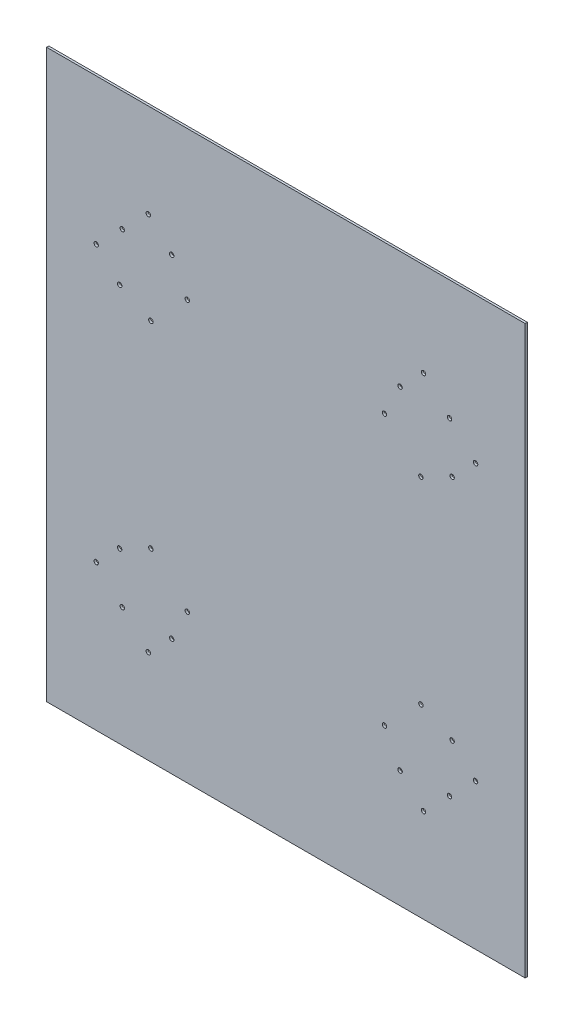
ISO-10303-21;
HEADER;
FILE_DESCRIPTION(('STEP AP214'),'2;1');
FILE_NAME('part.step','',(''),(''),'','','');
FILE_SCHEMA(('AUTOMOTIVE_DESIGN { 1 0 10303 214 1 1 1 1 }'));
ENDSEC;
DATA;
#1=APPLICATION_CONTEXT('core data for automotive mechanical design processes');
#2=APPLICATION_PROTOCOL_DEFINITION('international standard','automotive_design',2000,#1);
#3=PRODUCT_CONTEXT('',#1,'mechanical');
#4=PRODUCT('Part','Part','',(#3));
#5=PRODUCT_RELATED_PRODUCT_CATEGORY('part','',(#4));
#6=PRODUCT_DEFINITION_FORMATION('','',#4);
#7=PRODUCT_DEFINITION_CONTEXT('part definition',#1,'design');
#8=PRODUCT_DEFINITION('design','',#6,#7);
#9=PRODUCT_DEFINITION_SHAPE('','',#8);
#10=(LENGTH_UNIT() NAMED_UNIT(*) SI_UNIT(.MILLI.,.METRE.));
#11=(NAMED_UNIT(*) PLANE_ANGLE_UNIT() SI_UNIT($,.RADIAN.));
#12=(NAMED_UNIT(*) SI_UNIT($,.STERADIAN.) SOLID_ANGLE_UNIT());
#13=UNCERTAINTY_MEASURE_WITH_UNIT(LENGTH_MEASURE(1.E-05),#10,'distance_accuracy_value','');
#14=(GEOMETRIC_REPRESENTATION_CONTEXT(3) GLOBAL_UNCERTAINTY_ASSIGNED_CONTEXT((#13)) GLOBAL_UNIT_ASSIGNED_CONTEXT((#10,
#11,#12)) REPRESENTATION_CONTEXT('',''));
#15=CARTESIAN_POINT('',(0.,0.,0.));
#16=DIRECTION('',(0.,0.,1.));
#17=DIRECTION('',(1.,0.,0.));
#18=AXIS2_PLACEMENT_3D('',#15,#16,#17);
#19=CARTESIAN_POINT('',(0.,0.,3.));
#20=DIRECTION('',(0.,0.,1.));
#21=DIRECTION('',(1.,0.,0.));
#22=AXIS2_PLACEMENT_3D('',#19,#20,#21);
#23=PLANE('',#22);
#24=CARTESIAN_POINT('',(931.851249090738,-1320.80372791505,3.));
#25=DIRECTION('',(0.,0.,1.));
#26=DIRECTION('',(1.,0.,0.));
#27=AXIS2_PLACEMENT_3D('',#24,#25,#26);
#28=CIRCLE('',#27,3.00000000000015);
#29=CARTESIAN_POINT('',(934.851249090738,-1320.80372791505,3.));
#30=VERTEX_POINT('',#29);
#31=EDGE_CURVE('E265',#30,#30,#28,.T.);
#32=ORIENTED_EDGE('',*,*,#31,.F.);
#33=EDGE_LOOP('',(#32));
#34=FACE_BOUND('',#33,.T.);
#35=CARTESIAN_POINT('',(878.818240501748,-1246.55751589047,3.));
#36=DIRECTION('',(0.,0.,1.));
#37=DIRECTION('',(1.,0.,0.));
#38=AXIS2_PLACEMENT_3D('',#35,#36,#37);
#39=CIRCLE('',#38,3.00000000000015);
#40=CARTESIAN_POINT('',(881.818240501748,-1246.55751589047,3.));
#41=VERTEX_POINT('',#40);
#42=EDGE_CURVE('E253',#41,#41,#39,.T.);
#43=ORIENTED_EDGE('',*,*,#42,.F.);
#44=EDGE_LOOP('',(#43));
#45=FACE_BOUND('',#44,.T.);
#46=CARTESIAN_POINT('',(808.107562383088,-1317.26819400912,3.));
#47=DIRECTION('',(0.,0.,1.));
#48=DIRECTION('',(1.,0.,0.));
#49=AXIS2_PLACEMENT_3D('',#46,#47,#48);
#50=CIRCLE('',#49,3.00000000000015);
#51=CARTESIAN_POINT('',(811.107562383088,-1317.26819400912,3.));
#52=VERTEX_POINT('',#51);
#53=EDGE_CURVE('E241',#52,#52,#50,.T.);
#54=ORIENTED_EDGE('',*,*,#53,.F.);
#55=EDGE_LOOP('',(#54));
#56=FACE_BOUND('',#55,.T.);
#57=CARTESIAN_POINT('',(1249.20077248726,-1638.15325131158,3.));
#58=DIRECTION('',(0.,0.,1.));
#59=DIRECTION('',(1.,0.,0.));
#60=AXIS2_PLACEMENT_3D('',#57,#58,#59);
#61=CIRCLE('',#60,3.00000000000015);
#62=CARTESIAN_POINT('',(1252.20077248726,-1638.15325131158,3.));
#63=VERTEX_POINT('',#62);
#64=EDGE_CURVE('E229',#63,#63,#61,.T.);
#65=ORIENTED_EDGE('',*,*,#64,.F.);
#66=EDGE_LOOP('',(#65));
#67=FACE_BOUND('',#66,.T.);
#68=CARTESIAN_POINT('',(1220.9165012398,-1730.07713286583,3.));
#69=DIRECTION('',(0.,0.,1.));
#70=DIRECTION('',(1.,0.,0.));
#71=AXIS2_PLACEMENT_3D('',#68,#69,#70);
#72=CIRCLE('',#71,3.00000000000015);
#73=CARTESIAN_POINT('',(1223.9165012398,-1730.07713286583,3.));
#74=VERTEX_POINT('',#73);
#75=EDGE_CURVE('E217',#74,#74,#72,.T.);
#76=ORIENTED_EDGE('',*,*,#75,.F.);
#77=EDGE_LOOP('',(#76));
#78=FACE_BOUND('',#77,.T.);
#79=CARTESIAN_POINT('',(1288.09164545252,-1726.5415989599,3.));
#80=DIRECTION('',(0.,0.,1.));
#81=DIRECTION('',(1.,0.,0.));
#82=AXIS2_PLACEMENT_3D('',#79,#80,#81);
#83=CIRCLE('',#82,3.00000000000015);
#84=CARTESIAN_POINT('',(1291.09164545252,-1726.5415989599,3.));
#85=VERTEX_POINT('',#84);
#86=EDGE_CURVE('E205',#85,#85,#83,.T.);
#87=ORIENTED_EDGE('',*,*,#86,.F.);
#88=EDGE_LOOP('',(#87));
#89=FACE_BOUND('',#88,.T.);
#90=CARTESIAN_POINT('',(1291.62717935845,-1659.36645474718,3.));
#91=DIRECTION('',(0.,0.,1.));
#92=DIRECTION('',(1.,0.,0.));
#93=AXIS2_PLACEMENT_3D('',#90,#91,#92);
#94=CIRCLE('',#93,3.00000000000015);
#95=CARTESIAN_POINT('',(1294.62717935845,-1659.36645474718,3.));
#96=VERTEX_POINT('',#95);
#97=EDGE_CURVE('E193',#96,#96,#94,.T.);
#98=ORIENTED_EDGE('',*,*,#97,.F.);
#99=EDGE_LOOP('',(#98));
#100=FACE_BOUND('',#99,.T.);
#101=CARTESIAN_POINT('',(808.107562383088,-1691.18625990057,3.));
#102=DIRECTION('',(0.,0.,1.));
#103=DIRECTION('',(1.,0.,0.));
#104=AXIS2_PLACEMENT_3D('',#101,#102,#103);
#105=CIRCLE('',#104,3.00000000000015);
#106=CARTESIAN_POINT('',(811.107562383088,-1691.18625990057,3.));
#107=VERTEX_POINT('',#106);
#108=EDGE_CURVE('E181',#107,#107,#105,.T.);
#109=ORIENTED_EDGE('',*,*,#108,.F.);
#110=EDGE_LOOP('',(#109));
#111=FACE_BOUND('',#110,.T.);
#112=CARTESIAN_POINT('',(1252.73630639319,-1246.55751589047,3.));
#113=DIRECTION('',(0.,0.,1.));
#114=DIRECTION('',(1.,0.,0.));
#115=AXIS2_PLACEMENT_3D('',#112,#113,#114);
#116=CIRCLE('',#115,3.00000000000015);
#117=CARTESIAN_POINT('',(1255.73630639319,-1246.55751589047,3.));
#118=VERTEX_POINT('',#117);
#119=EDGE_CURVE('E169',#118,#118,#116,.T.);
#120=ORIENTED_EDGE('',*,*,#119,.F.);
#121=EDGE_LOOP('',(#120));
#122=FACE_BOUND('',#121,.T.);
#123=CARTESIAN_POINT('',(1220.9165012398,-1278.37732104386,3.));
#124=DIRECTION('',(0.,0.,1.));
#125=DIRECTION('',(1.,0.,0.));
#126=AXIS2_PLACEMENT_3D('',#123,#124,#125);
#127=CIRCLE('',#126,3.00000000000037);
#128=CARTESIAN_POINT('',(1223.9165012398,-1278.37732104386,3.));
#129=VERTEX_POINT('',#128);
#130=EDGE_CURVE('E157',#129,#129,#127,.T.);
#131=ORIENTED_EDGE('',*,*,#130,.F.);
#132=EDGE_LOOP('',(#131));
#133=FACE_BOUND('',#132,.T.);
#134=CARTESIAN_POINT('',(1249.20077248726,-1370.30120259811,3.));
#135=DIRECTION('',(0.,0.,1.));
#136=DIRECTION('',(1.,0.,0.));
#137=AXIS2_PLACEMENT_3D('',#134,#135,#136);
#138=CIRCLE('',#137,3.00000000000037);
#139=CARTESIAN_POINT('',(1252.20077248726,-1370.30120259811,3.));
#140=VERTEX_POINT('',#139);
#141=EDGE_CURVE('E145',#140,#140,#138,.T.);
#142=ORIENTED_EDGE('',*,*,#141,.F.);
#143=EDGE_LOOP('',(#142));
#144=FACE_BOUND('',#143,.T.);
#145=CARTESIAN_POINT('',(878.818240501748,-1761.89693801922,3.));
#146=DIRECTION('',(0.,0.,1.));
#147=DIRECTION('',(1.,0.,0.));
#148=AXIS2_PLACEMENT_3D('',#145,#146,#147);
#149=CIRCLE('',#148,3.00000000000015);
#150=CARTESIAN_POINT('',(881.818240501748,-1761.89693801922,3.));
#151=VERTEX_POINT('',#150);
#152=EDGE_CURVE('E133',#151,#151,#149,.T.);
#153=ORIENTED_EDGE('',*,*,#152,.F.);
#154=EDGE_LOOP('',(#153));
#155=FACE_BOUND('',#154,.T.);
#156=CARTESIAN_POINT('',(931.851249090738,-1687.65072599464,3.));
#157=DIRECTION('',(0.,0.,1.));
#158=DIRECTION('',(1.,0.,0.));
#159=AXIS2_PLACEMENT_3D('',#156,#157,#158);
#160=CIRCLE('',#159,3.00000000000015);
#161=CARTESIAN_POINT('',(934.851249090738,-1687.65072599464,3.));
#162=VERTEX_POINT('',#161);
#163=EDGE_CURVE('E121',#162,#162,#160,.T.);
#164=ORIENTED_EDGE('',*,*,#163,.F.);
#165=EDGE_LOOP('',(#164));
#166=FACE_BOUND('',#165,.T.);
#167=CARTESIAN_POINT('',(1288.09164545252,-1281.9128549498,3.));
#168=DIRECTION('',(0.,0.,1.));
#169=DIRECTION('',(1.,0.,0.));
#170=AXIS2_PLACEMENT_3D('',#167,#168,#169);
#171=CIRCLE('',#170,3.00000000000015);
#172=CARTESIAN_POINT('',(1291.09164545252,-1281.9128549498,3.));
#173=VERTEX_POINT('',#172);
#174=EDGE_CURVE('E100',#173,#173,#171,.T.);
#175=ORIENTED_EDGE('',*,*,#174,.F.);
#176=EDGE_LOOP('',(#175));
#177=FACE_BOUND('',#176,.T.);
#178=DIRECTION('',(0.,-1.,0.));
#179=VECTOR('',#178,1.);
#180=CARTESIAN_POINT('',(740.777273447474,-1119.22722695485,3.));
#181=LINE('',#180,#179);
#182=CARTESIAN_POINT('',(740.777273447474,-1119.22722695485,3.));
#183=VERTEX_POINT('',#182);
#184=CARTESIAN_POINT('',(740.777273447474,-1889.22722695485,3.));
#185=VERTEX_POINT('',#184);
#186=EDGE_CURVE('E85',#183,#185,#181,.T.);
#187=ORIENTED_EDGE('',*,*,#186,.T.);
#188=DIRECTION('',(1.,0.,0.));
#189=VECTOR('',#188,1.);
#190=CARTESIAN_POINT('',(740.777273447474,-1889.22722695485,3.));
#191=LINE('',#190,#189);
#192=CARTESIAN_POINT('',(1390.77727344747,-1889.22722695485,3.));
#193=VERTEX_POINT('',#192);
#194=EDGE_CURVE('E80',#185,#193,#191,.T.);
#195=ORIENTED_EDGE('',*,*,#194,.T.);
#196=DIRECTION('',(0.,1.,0.));
#197=VECTOR('',#196,1.);
#198=CARTESIAN_POINT('',(1390.77727344747,-1889.22722695485,3.));
#199=LINE('',#198,#197);
#200=CARTESIAN_POINT('',(1390.77727344747,-1119.22722695485,3.));
#201=VERTEX_POINT('',#200);
#202=EDGE_CURVE('E83',#193,#201,#199,.T.);
#203=ORIENTED_EDGE('',*,*,#202,.T.);
#204=DIRECTION('',(-1.,0.,0.));
#205=VECTOR('',#204,1.);
#206=CARTESIAN_POINT('',(1390.77727344747,-1119.22722695485,3.));
#207=LINE('',#206,#205);
#208=EDGE_CURVE('E50',#201,#183,#207,.T.);
#209=ORIENTED_EDGE('',*,*,#208,.T.);
#210=EDGE_LOOP('',(#187,#195,#203,#209));
#211=FACE_BOUND('',#210,.T.);
#212=CARTESIAN_POINT('',(843.462901442418,-1726.5415989599,3.));
#213=DIRECTION('',(0.,0.,1.));
#214=DIRECTION('',(1.,0.,0.));
#215=AXIS2_PLACEMENT_3D('',#212,#213,#214);
#216=CIRCLE('',#215,3.00000000000015);
#217=CARTESIAN_POINT('',(846.462901442418,-1726.5415989599,3.));
#218=VERTEX_POINT('',#217);
#219=EDGE_CURVE('E115',#218,#218,#216,.T.);
#220=ORIENTED_EDGE('',*,*,#219,.F.);
#221=EDGE_LOOP('',(#220));
#222=FACE_BOUND('',#221,.T.);
#223=CARTESIAN_POINT('',(910.638045655138,-1730.07713286583,3.));
#224=DIRECTION('',(0.,0.,1.));
#225=DIRECTION('',(1.,0.,0.));
#226=AXIS2_PLACEMENT_3D('',#223,#224,#225);
#227=CIRCLE('',#226,3.00000000000015);
#228=CARTESIAN_POINT('',(913.638045655138,-1730.07713286583,3.));
#229=VERTEX_POINT('',#228);
#230=EDGE_CURVE('E127',#229,#229,#227,.T.);
#231=ORIENTED_EDGE('',*,*,#230,.F.);
#232=EDGE_LOOP('',(#231));
#233=FACE_BOUND('',#232,.T.);
#234=CARTESIAN_POINT('',(1323.44698451185,-1317.26819400912,3.));
#235=DIRECTION('',(0.,0.,1.));
#236=DIRECTION('',(1.,0.,0.));
#237=AXIS2_PLACEMENT_3D('',#234,#235,#236);
#238=CIRCLE('',#237,3.00000000000015);
#239=CARTESIAN_POINT('',(1326.44698451185,-1317.26819400912,3.));
#240=VERTEX_POINT('',#239);
#241=EDGE_CURVE('E139',#240,#240,#238,.T.);
#242=ORIENTED_EDGE('',*,*,#241,.F.);
#243=EDGE_LOOP('',(#242));
#244=FACE_BOUND('',#243,.T.);
#245=CARTESIAN_POINT('',(1291.62717935845,-1349.08799916252,3.));
#246=DIRECTION('',(0.,0.,1.));
#247=DIRECTION('',(1.,0.,0.));
#248=AXIS2_PLACEMENT_3D('',#245,#246,#247);
#249=CIRCLE('',#248,3.00000000000015);
#250=CARTESIAN_POINT('',(1294.62717935845,-1349.08799916252,3.));
#251=VERTEX_POINT('',#250);
#252=EDGE_CURVE('E151',#251,#251,#249,.T.);
#253=ORIENTED_EDGE('',*,*,#252,.F.);
#254=EDGE_LOOP('',(#253));
#255=FACE_BOUND('',#254,.T.);
#256=CARTESIAN_POINT('',(1199.7032978042,-1320.80372791506,3.));
#257=DIRECTION('',(0.,0.,1.));
#258=DIRECTION('',(1.,0.,0.));
#259=AXIS2_PLACEMENT_3D('',#256,#257,#258);
#260=CIRCLE('',#259,3.00000000000015);
#261=CARTESIAN_POINT('',(1202.7032978042,-1320.80372791506,3.));
#262=VERTEX_POINT('',#261);
#263=EDGE_CURVE('E163',#262,#262,#260,.T.);
#264=ORIENTED_EDGE('',*,*,#263,.F.);
#265=EDGE_LOOP('',(#264));
#266=FACE_BOUND('',#265,.T.);
#267=CARTESIAN_POINT('',(882.353774407678,-1638.15325131158,3.));
#268=DIRECTION('',(0.,0.,1.));
#269=DIRECTION('',(1.,0.,0.));
#270=AXIS2_PLACEMENT_3D('',#267,#268,#269);
#271=CIRCLE('',#270,3.00000000000015);
#272=CARTESIAN_POINT('',(885.353774407678,-1638.15325131158,3.));
#273=VERTEX_POINT('',#272);
#274=EDGE_CURVE('E175',#273,#273,#271,.T.);
#275=ORIENTED_EDGE('',*,*,#274,.F.);
#276=EDGE_LOOP('',(#275));
#277=FACE_BOUND('',#276,.T.);
#278=CARTESIAN_POINT('',(839.927367536488,-1659.36645474717,3.));
#279=DIRECTION('',(0.,0.,1.));
#280=DIRECTION('',(1.,0.,0.));
#281=AXIS2_PLACEMENT_3D('',#278,#279,#280);
#282=CIRCLE('',#281,3.00000000000015);
#283=CARTESIAN_POINT('',(842.927367536488,-1659.36645474717,3.));
#284=VERTEX_POINT('',#283);
#285=EDGE_CURVE('E187',#284,#284,#282,.T.);
#286=ORIENTED_EDGE('',*,*,#285,.F.);
#287=EDGE_LOOP('',(#286));
#288=FACE_BOUND('',#287,.T.);
#289=CARTESIAN_POINT('',(1323.44698451185,-1691.18625990057,3.));
#290=DIRECTION('',(0.,0.,1.));
#291=DIRECTION('',(1.,0.,0.));
#292=AXIS2_PLACEMENT_3D('',#289,#290,#291);
#293=CIRCLE('',#292,3.00000000000015);
#294=CARTESIAN_POINT('',(1326.44698451185,-1691.18625990057,3.));
#295=VERTEX_POINT('',#294);
#296=EDGE_CURVE('E199',#295,#295,#293,.T.);
#297=ORIENTED_EDGE('',*,*,#296,.F.);
#298=EDGE_LOOP('',(#297));
#299=FACE_BOUND('',#298,.T.);
#300=CARTESIAN_POINT('',(1252.73630639319,-1761.89693801923,3.));
#301=DIRECTION('',(0.,0.,1.));
#302=DIRECTION('',(1.,0.,0.));
#303=AXIS2_PLACEMENT_3D('',#300,#301,#302);
#304=CIRCLE('',#303,3.00000000000015);
#305=CARTESIAN_POINT('',(1255.73630639319,-1761.89693801923,3.));
#306=VERTEX_POINT('',#305);
#307=EDGE_CURVE('E211',#306,#306,#304,.T.);
#308=ORIENTED_EDGE('',*,*,#307,.F.);
#309=EDGE_LOOP('',(#308));
#310=FACE_BOUND('',#309,.T.);
#311=CARTESIAN_POINT('',(1199.7032978042,-1687.65072599464,3.));
#312=DIRECTION('',(0.,0.,1.));
#313=DIRECTION('',(1.,0.,0.));
#314=AXIS2_PLACEMENT_3D('',#311,#312,#313);
#315=CIRCLE('',#314,3.00000000000015);
#316=CARTESIAN_POINT('',(1202.7032978042,-1687.65072599464,3.));
#317=VERTEX_POINT('',#316);
#318=EDGE_CURVE('E223',#317,#317,#315,.T.);
#319=ORIENTED_EDGE('',*,*,#318,.F.);
#320=EDGE_LOOP('',(#319));
#321=FACE_BOUND('',#320,.T.);
#322=CARTESIAN_POINT('',(839.927367536488,-1349.08799916252,3.));
#323=DIRECTION('',(0.,0.,1.));
#324=DIRECTION('',(1.,0.,0.));
#325=AXIS2_PLACEMENT_3D('',#322,#323,#324);
#326=CIRCLE('',#325,3.00000000000015);
#327=CARTESIAN_POINT('',(842.927367536488,-1349.08799916252,3.));
#328=VERTEX_POINT('',#327);
#329=EDGE_CURVE('E235',#328,#328,#326,.T.);
#330=ORIENTED_EDGE('',*,*,#329,.F.);
#331=EDGE_LOOP('',(#330));
#332=FACE_BOUND('',#331,.T.);
#333=CARTESIAN_POINT('',(843.462901442418,-1281.9128549498,3.));
#334=DIRECTION('',(0.,0.,1.));
#335=DIRECTION('',(1.,0.,0.));
#336=AXIS2_PLACEMENT_3D('',#333,#334,#335);
#337=CIRCLE('',#336,3.00000000000015);
#338=CARTESIAN_POINT('',(846.462901442418,-1281.9128549498,3.));
#339=VERTEX_POINT('',#338);
#340=EDGE_CURVE('E247',#339,#339,#337,.T.);
#341=ORIENTED_EDGE('',*,*,#340,.F.);
#342=EDGE_LOOP('',(#341));
#343=FACE_BOUND('',#342,.T.);
#344=CARTESIAN_POINT('',(910.638045655138,-1278.37732104386,3.));
#345=DIRECTION('',(0.,0.,1.));
#346=DIRECTION('',(1.,0.,0.));
#347=AXIS2_PLACEMENT_3D('',#344,#345,#346);
#348=CIRCLE('',#347,3.00000000000015);
#349=CARTESIAN_POINT('',(913.638045655138,-1278.37732104386,3.));
#350=VERTEX_POINT('',#349);
#351=EDGE_CURVE('E259',#350,#350,#348,.T.);
#352=ORIENTED_EDGE('',*,*,#351,.F.);
#353=EDGE_LOOP('',(#352));
#354=FACE_BOUND('',#353,.T.);
#355=CARTESIAN_POINT('',(882.353774407678,-1370.30120259811,3.));
#356=DIRECTION('',(0.,0.,1.));
#357=DIRECTION('',(1.,0.,0.));
#358=AXIS2_PLACEMENT_3D('',#355,#356,#357);
#359=CIRCLE('',#358,3.00000000000015);
#360=CARTESIAN_POINT('',(885.353774407678,-1370.30120259811,3.));
#361=VERTEX_POINT('',#360);
#362=EDGE_CURVE('E271',#361,#361,#359,.T.);
#363=ORIENTED_EDGE('',*,*,#362,.F.);
#364=EDGE_LOOP('',(#363));
#365=FACE_BOUND('',#364,.T.);
#366=ADVANCED_FACE('F33',(#34,#45,#56,#67,#78,#89,#100,#111,#122,#133,#144,#155,#166,#177,#211,
#222,#233,#244,#255,#266,#277,#288,#299,#310,#321,#332,#343,#354,#365),#23,.T.);
#367=CARTESIAN_POINT('',(0.,0.,0.));
#368=DIRECTION('',(0.,0.,1.));
#369=DIRECTION('',(1.,0.,0.));
#370=AXIS2_PLACEMENT_3D('',#367,#368,#369);
#371=PLANE('',#370);
#372=DIRECTION('',(0.,-1.,0.));
#373=VECTOR('',#372,1.);
#374=CARTESIAN_POINT('',(740.777273447474,-1119.22722695485,0.));
#375=LINE('',#374,#373);
#376=CARTESIAN_POINT('',(740.777273447474,-1119.22722695485,0.));
#377=VERTEX_POINT('',#376);
#378=CARTESIAN_POINT('',(740.777273447474,-1889.22722695485,0.));
#379=VERTEX_POINT('',#378);
#380=EDGE_CURVE('E97',#377,#379,#375,.T.);
#381=ORIENTED_EDGE('',*,*,#380,.F.);
#382=DIRECTION('',(-1.,0.,0.));
#383=VECTOR('',#382,1.);
#384=CARTESIAN_POINT('',(1390.77727344747,-1119.22722695485,0.));
#385=LINE('',#384,#383);
#386=CARTESIAN_POINT('',(1390.77727344747,-1119.22722695485,0.));
#387=VERTEX_POINT('',#386);
#388=EDGE_CURVE('E73',#387,#377,#385,.T.);
#389=ORIENTED_EDGE('',*,*,#388,.F.);
#390=DIRECTION('',(0.,1.,0.));
#391=VECTOR('',#390,1.);
#392=CARTESIAN_POINT('',(1390.77727344747,-1889.22722695485,0.));
#393=LINE('',#392,#391);
#394=CARTESIAN_POINT('',(1390.77727344747,-1889.22722695485,0.));
#395=VERTEX_POINT('',#394);
#396=EDGE_CURVE('E67',#395,#387,#393,.T.);
#397=ORIENTED_EDGE('',*,*,#396,.F.);
#398=DIRECTION('',(1.,0.,0.));
#399=VECTOR('',#398,1.);
#400=CARTESIAN_POINT('',(740.777273447474,-1889.22722695485,0.));
#401=LINE('',#400,#399);
#402=EDGE_CURVE('E89',#379,#395,#401,.T.);
#403=ORIENTED_EDGE('',*,*,#402,.F.);
#404=EDGE_LOOP('',(#381,#389,#397,#403));
#405=FACE_BOUND('',#404,.T.);
#406=CARTESIAN_POINT('',(1288.09164545252,-1281.9128549498,0.));
#407=DIRECTION('',(0.,0.,1.));
#408=DIRECTION('',(1.,0.,0.));
#409=AXIS2_PLACEMENT_3D('',#406,#407,#408);
#410=CIRCLE('',#409,3.00000000000015);
#411=CARTESIAN_POINT('',(1291.09164545252,-1281.9128549498,0.));
#412=VERTEX_POINT('',#411);
#413=EDGE_CURVE('E112',#412,#412,#410,.T.);
#414=ORIENTED_EDGE('',*,*,#413,.T.);
#415=EDGE_LOOP('',(#414));
#416=FACE_BOUND('',#415,.T.);
#417=CARTESIAN_POINT('',(843.462901442418,-1726.5415989599,0.));
#418=DIRECTION('',(0.,0.,1.));
#419=DIRECTION('',(1.,0.,0.));
#420=AXIS2_PLACEMENT_3D('',#417,#418,#419);
#421=CIRCLE('',#420,3.00000000000015);
#422=CARTESIAN_POINT('',(846.462901442418,-1726.5415989599,0.));
#423=VERTEX_POINT('',#422);
#424=EDGE_CURVE('E118',#423,#423,#421,.T.);
#425=ORIENTED_EDGE('',*,*,#424,.T.);
#426=EDGE_LOOP('',(#425));
#427=FACE_BOUND('',#426,.T.);
#428=CARTESIAN_POINT('',(931.851249090738,-1687.65072599464,0.));
#429=DIRECTION('',(0.,0.,1.));
#430=DIRECTION('',(1.,0.,0.));
#431=AXIS2_PLACEMENT_3D('',#428,#429,#430);
#432=CIRCLE('',#431,3.00000000000015);
#433=CARTESIAN_POINT('',(934.851249090738,-1687.65072599464,0.));
#434=VERTEX_POINT('',#433);
#435=EDGE_CURVE('E124',#434,#434,#432,.T.);
#436=ORIENTED_EDGE('',*,*,#435,.T.);
#437=EDGE_LOOP('',(#436));
#438=FACE_BOUND('',#437,.T.);
#439=CARTESIAN_POINT('',(910.638045655138,-1730.07713286583,0.));
#440=DIRECTION('',(0.,0.,1.));
#441=DIRECTION('',(1.,0.,0.));
#442=AXIS2_PLACEMENT_3D('',#439,#440,#441);
#443=CIRCLE('',#442,3.00000000000015);
#444=CARTESIAN_POINT('',(913.638045655138,-1730.07713286583,0.));
#445=VERTEX_POINT('',#444);
#446=EDGE_CURVE('E130',#445,#445,#443,.T.);
#447=ORIENTED_EDGE('',*,*,#446,.T.);
#448=EDGE_LOOP('',(#447));
#449=FACE_BOUND('',#448,.T.);
#450=CARTESIAN_POINT('',(878.818240501748,-1761.89693801922,0.));
#451=DIRECTION('',(0.,0.,1.));
#452=DIRECTION('',(1.,0.,0.));
#453=AXIS2_PLACEMENT_3D('',#450,#451,#452);
#454=CIRCLE('',#453,3.00000000000015);
#455=CARTESIAN_POINT('',(881.818240501748,-1761.89693801922,0.));
#456=VERTEX_POINT('',#455);
#457=EDGE_CURVE('E136',#456,#456,#454,.T.);
#458=ORIENTED_EDGE('',*,*,#457,.T.);
#459=EDGE_LOOP('',(#458));
#460=FACE_BOUND('',#459,.T.);
#461=CARTESIAN_POINT('',(1323.44698451185,-1317.26819400912,0.));
#462=DIRECTION('',(0.,0.,1.));
#463=DIRECTION('',(1.,0.,0.));
#464=AXIS2_PLACEMENT_3D('',#461,#462,#463);
#465=CIRCLE('',#464,3.00000000000015);
#466=CARTESIAN_POINT('',(1326.44698451185,-1317.26819400912,0.));
#467=VERTEX_POINT('',#466);
#468=EDGE_CURVE('E142',#467,#467,#465,.T.);
#469=ORIENTED_EDGE('',*,*,#468,.T.);
#470=EDGE_LOOP('',(#469));
#471=FACE_BOUND('',#470,.T.);
#472=CARTESIAN_POINT('',(1249.20077248726,-1370.30120259811,0.));
#473=DIRECTION('',(0.,0.,1.));
#474=DIRECTION('',(1.,0.,0.));
#475=AXIS2_PLACEMENT_3D('',#472,#473,#474);
#476=CIRCLE('',#475,3.00000000000037);
#477=CARTESIAN_POINT('',(1252.20077248726,-1370.30120259811,0.));
#478=VERTEX_POINT('',#477);
#479=EDGE_CURVE('E148',#478,#478,#476,.T.);
#480=ORIENTED_EDGE('',*,*,#479,.T.);
#481=EDGE_LOOP('',(#480));
#482=FACE_BOUND('',#481,.T.);
#483=CARTESIAN_POINT('',(1291.62717935845,-1349.08799916252,0.));
#484=DIRECTION('',(0.,0.,1.));
#485=DIRECTION('',(1.,0.,0.));
#486=AXIS2_PLACEMENT_3D('',#483,#484,#485);
#487=CIRCLE('',#486,3.00000000000015);
#488=CARTESIAN_POINT('',(1294.62717935845,-1349.08799916252,0.));
#489=VERTEX_POINT('',#488);
#490=EDGE_CURVE('E154',#489,#489,#487,.T.);
#491=ORIENTED_EDGE('',*,*,#490,.T.);
#492=EDGE_LOOP('',(#491));
#493=FACE_BOUND('',#492,.T.);
#494=CARTESIAN_POINT('',(1220.9165012398,-1278.37732104386,0.));
#495=DIRECTION('',(0.,0.,1.));
#496=DIRECTION('',(1.,0.,0.));
#497=AXIS2_PLACEMENT_3D('',#494,#495,#496);
#498=CIRCLE('',#497,3.00000000000037);
#499=CARTESIAN_POINT('',(1223.9165012398,-1278.37732104386,0.));
#500=VERTEX_POINT('',#499);
#501=EDGE_CURVE('E160',#500,#500,#498,.T.);
#502=ORIENTED_EDGE('',*,*,#501,.T.);
#503=EDGE_LOOP('',(#502));
#504=FACE_BOUND('',#503,.T.);
#505=CARTESIAN_POINT('',(1199.7032978042,-1320.80372791506,0.));
#506=DIRECTION('',(0.,0.,1.));
#507=DIRECTION('',(1.,0.,0.));
#508=AXIS2_PLACEMENT_3D('',#505,#506,#507);
#509=CIRCLE('',#508,3.00000000000015);
#510=CARTESIAN_POINT('',(1202.7032978042,-1320.80372791506,0.));
#511=VERTEX_POINT('',#510);
#512=EDGE_CURVE('E166',#511,#511,#509,.T.);
#513=ORIENTED_EDGE('',*,*,#512,.T.);
#514=EDGE_LOOP('',(#513));
#515=FACE_BOUND('',#514,.T.);
#516=CARTESIAN_POINT('',(1252.73630639319,-1246.55751589047,0.));
#517=DIRECTION('',(0.,0.,1.));
#518=DIRECTION('',(1.,0.,0.));
#519=AXIS2_PLACEMENT_3D('',#516,#517,#518);
#520=CIRCLE('',#519,3.00000000000015);
#521=CARTESIAN_POINT('',(1255.73630639319,-1246.55751589047,0.));
#522=VERTEX_POINT('',#521);
#523=EDGE_CURVE('E172',#522,#522,#520,.T.);
#524=ORIENTED_EDGE('',*,*,#523,.T.);
#525=EDGE_LOOP('',(#524));
#526=FACE_BOUND('',#525,.T.);
#527=CARTESIAN_POINT('',(882.353774407678,-1638.15325131158,0.));
#528=DIRECTION('',(0.,0.,1.));
#529=DIRECTION('',(1.,0.,0.));
#530=AXIS2_PLACEMENT_3D('',#527,#528,#529);
#531=CIRCLE('',#530,3.00000000000015);
#532=CARTESIAN_POINT('',(885.353774407678,-1638.15325131158,0.));
#533=VERTEX_POINT('',#532);
#534=EDGE_CURVE('E178',#533,#533,#531,.T.);
#535=ORIENTED_EDGE('',*,*,#534,.T.);
#536=EDGE_LOOP('',(#535));
#537=FACE_BOUND('',#536,.T.);
#538=CARTESIAN_POINT('',(808.107562383088,-1691.18625990057,0.));
#539=DIRECTION('',(0.,0.,1.));
#540=DIRECTION('',(1.,0.,0.));
#541=AXIS2_PLACEMENT_3D('',#538,#539,#540);
#542=CIRCLE('',#541,3.00000000000015);
#543=CARTESIAN_POINT('',(811.107562383088,-1691.18625990057,0.));
#544=VERTEX_POINT('',#543);
#545=EDGE_CURVE('E184',#544,#544,#542,.T.);
#546=ORIENTED_EDGE('',*,*,#545,.T.);
#547=EDGE_LOOP('',(#546));
#548=FACE_BOUND('',#547,.T.);
#549=CARTESIAN_POINT('',(839.927367536488,-1659.36645474717,0.));
#550=DIRECTION('',(0.,0.,1.));
#551=DIRECTION('',(1.,0.,0.));
#552=AXIS2_PLACEMENT_3D('',#549,#550,#551);
#553=CIRCLE('',#552,3.00000000000015);
#554=CARTESIAN_POINT('',(842.927367536488,-1659.36645474717,0.));
#555=VERTEX_POINT('',#554);
#556=EDGE_CURVE('E190',#555,#555,#553,.T.);
#557=ORIENTED_EDGE('',*,*,#556,.T.);
#558=EDGE_LOOP('',(#557));
#559=FACE_BOUND('',#558,.T.);
#560=CARTESIAN_POINT('',(1291.62717935845,-1659.36645474718,0.));
#561=DIRECTION('',(0.,0.,1.));
#562=DIRECTION('',(1.,0.,0.));
#563=AXIS2_PLACEMENT_3D('',#560,#561,#562);
#564=CIRCLE('',#563,3.00000000000015);
#565=CARTESIAN_POINT('',(1294.62717935845,-1659.36645474718,0.));
#566=VERTEX_POINT('',#565);
#567=EDGE_CURVE('E196',#566,#566,#564,.T.);
#568=ORIENTED_EDGE('',*,*,#567,.T.);
#569=EDGE_LOOP('',(#568));
#570=FACE_BOUND('',#569,.T.);
#571=CARTESIAN_POINT('',(1323.44698451185,-1691.18625990057,0.));
#572=DIRECTION('',(0.,0.,1.));
#573=DIRECTION('',(1.,0.,0.));
#574=AXIS2_PLACEMENT_3D('',#571,#572,#573);
#575=CIRCLE('',#574,3.00000000000015);
#576=CARTESIAN_POINT('',(1326.44698451185,-1691.18625990057,0.));
#577=VERTEX_POINT('',#576);
#578=EDGE_CURVE('E202',#577,#577,#575,.T.);
#579=ORIENTED_EDGE('',*,*,#578,.T.);
#580=EDGE_LOOP('',(#579));
#581=FACE_BOUND('',#580,.T.);
#582=CARTESIAN_POINT('',(1288.09164545252,-1726.5415989599,0.));
#583=DIRECTION('',(0.,0.,1.));
#584=DIRECTION('',(1.,0.,0.));
#585=AXIS2_PLACEMENT_3D('',#582,#583,#584);
#586=CIRCLE('',#585,3.00000000000015);
#587=CARTESIAN_POINT('',(1291.09164545252,-1726.5415989599,0.));
#588=VERTEX_POINT('',#587);
#589=EDGE_CURVE('E208',#588,#588,#586,.T.);
#590=ORIENTED_EDGE('',*,*,#589,.T.);
#591=EDGE_LOOP('',(#590));
#592=FACE_BOUND('',#591,.T.);
#593=CARTESIAN_POINT('',(1252.73630639319,-1761.89693801923,0.));
#594=DIRECTION('',(0.,0.,1.));
#595=DIRECTION('',(1.,0.,0.));
#596=AXIS2_PLACEMENT_3D('',#593,#594,#595);
#597=CIRCLE('',#596,3.00000000000015);
#598=CARTESIAN_POINT('',(1255.73630639319,-1761.89693801923,0.));
#599=VERTEX_POINT('',#598);
#600=EDGE_CURVE('E214',#599,#599,#597,.T.);
#601=ORIENTED_EDGE('',*,*,#600,.T.);
#602=EDGE_LOOP('',(#601));
#603=FACE_BOUND('',#602,.T.);
#604=CARTESIAN_POINT('',(1220.9165012398,-1730.07713286583,0.));
#605=DIRECTION('',(0.,0.,1.));
#606=DIRECTION('',(1.,0.,0.));
#607=AXIS2_PLACEMENT_3D('',#604,#605,#606);
#608=CIRCLE('',#607,3.00000000000015);
#609=CARTESIAN_POINT('',(1223.9165012398,-1730.07713286583,0.));
#610=VERTEX_POINT('',#609);
#611=EDGE_CURVE('E220',#610,#610,#608,.T.);
#612=ORIENTED_EDGE('',*,*,#611,.T.);
#613=EDGE_LOOP('',(#612));
#614=FACE_BOUND('',#613,.T.);
#615=CARTESIAN_POINT('',(1199.7032978042,-1687.65072599464,0.));
#616=DIRECTION('',(0.,0.,1.));
#617=DIRECTION('',(1.,0.,0.));
#618=AXIS2_PLACEMENT_3D('',#615,#616,#617);
#619=CIRCLE('',#618,3.00000000000015);
#620=CARTESIAN_POINT('',(1202.7032978042,-1687.65072599464,0.));
#621=VERTEX_POINT('',#620);
#622=EDGE_CURVE('E226',#621,#621,#619,.T.);
#623=ORIENTED_EDGE('',*,*,#622,.T.);
#624=EDGE_LOOP('',(#623));
#625=FACE_BOUND('',#624,.T.);
#626=CARTESIAN_POINT('',(1249.20077248726,-1638.15325131158,0.));
#627=DIRECTION('',(0.,0.,1.));
#628=DIRECTION('',(1.,0.,0.));
#629=AXIS2_PLACEMENT_3D('',#626,#627,#628);
#630=CIRCLE('',#629,3.00000000000015);
#631=CARTESIAN_POINT('',(1252.20077248726,-1638.15325131158,0.));
#632=VERTEX_POINT('',#631);
#633=EDGE_CURVE('E232',#632,#632,#630,.T.);
#634=ORIENTED_EDGE('',*,*,#633,.T.);
#635=EDGE_LOOP('',(#634));
#636=FACE_BOUND('',#635,.T.);
#637=CARTESIAN_POINT('',(839.927367536488,-1349.08799916252,0.));
#638=DIRECTION('',(0.,0.,1.));
#639=DIRECTION('',(1.,0.,0.));
#640=AXIS2_PLACEMENT_3D('',#637,#638,#639);
#641=CIRCLE('',#640,3.00000000000015);
#642=CARTESIAN_POINT('',(842.927367536488,-1349.08799916252,0.));
#643=VERTEX_POINT('',#642);
#644=EDGE_CURVE('E238',#643,#643,#641,.T.);
#645=ORIENTED_EDGE('',*,*,#644,.T.);
#646=EDGE_LOOP('',(#645));
#647=FACE_BOUND('',#646,.T.);
#648=CARTESIAN_POINT('',(808.107562383088,-1317.26819400912,0.));
#649=DIRECTION('',(0.,0.,1.));
#650=DIRECTION('',(1.,0.,0.));
#651=AXIS2_PLACEMENT_3D('',#648,#649,#650);
#652=CIRCLE('',#651,3.00000000000015);
#653=CARTESIAN_POINT('',(811.107562383088,-1317.26819400912,0.));
#654=VERTEX_POINT('',#653);
#655=EDGE_CURVE('E244',#654,#654,#652,.T.);
#656=ORIENTED_EDGE('',*,*,#655,.T.);
#657=EDGE_LOOP('',(#656));
#658=FACE_BOUND('',#657,.T.);
#659=CARTESIAN_POINT('',(843.462901442418,-1281.9128549498,0.));
#660=DIRECTION('',(0.,0.,1.));
#661=DIRECTION('',(1.,0.,0.));
#662=AXIS2_PLACEMENT_3D('',#659,#660,#661);
#663=CIRCLE('',#662,3.00000000000015);
#664=CARTESIAN_POINT('',(846.462901442418,-1281.9128549498,0.));
#665=VERTEX_POINT('',#664);
#666=EDGE_CURVE('E250',#665,#665,#663,.T.);
#667=ORIENTED_EDGE('',*,*,#666,.T.);
#668=EDGE_LOOP('',(#667));
#669=FACE_BOUND('',#668,.T.);
#670=CARTESIAN_POINT('',(878.818240501748,-1246.55751589047,0.));
#671=DIRECTION('',(0.,0.,1.));
#672=DIRECTION('',(1.,0.,0.));
#673=AXIS2_PLACEMENT_3D('',#670,#671,#672);
#674=CIRCLE('',#673,3.00000000000015);
#675=CARTESIAN_POINT('',(881.818240501748,-1246.55751589047,0.));
#676=VERTEX_POINT('',#675);
#677=EDGE_CURVE('E256',#676,#676,#674,.T.);
#678=ORIENTED_EDGE('',*,*,#677,.T.);
#679=EDGE_LOOP('',(#678));
#680=FACE_BOUND('',#679,.T.);
#681=CARTESIAN_POINT('',(910.638045655138,-1278.37732104386,0.));
#682=DIRECTION('',(0.,0.,1.));
#683=DIRECTION('',(1.,0.,0.));
#684=AXIS2_PLACEMENT_3D('',#681,#682,#683);
#685=CIRCLE('',#684,3.00000000000015);
#686=CARTESIAN_POINT('',(913.638045655138,-1278.37732104386,0.));
#687=VERTEX_POINT('',#686);
#688=EDGE_CURVE('E262',#687,#687,#685,.T.);
#689=ORIENTED_EDGE('',*,*,#688,.T.);
#690=EDGE_LOOP('',(#689));
#691=FACE_BOUND('',#690,.T.);
#692=CARTESIAN_POINT('',(931.851249090738,-1320.80372791505,0.));
#693=DIRECTION('',(0.,0.,1.));
#694=DIRECTION('',(1.,0.,0.));
#695=AXIS2_PLACEMENT_3D('',#692,#693,#694);
#696=CIRCLE('',#695,3.00000000000015);
#697=CARTESIAN_POINT('',(934.851249090738,-1320.80372791505,0.));
#698=VERTEX_POINT('',#697);
#699=EDGE_CURVE('E268',#698,#698,#696,.T.);
#700=ORIENTED_EDGE('',*,*,#699,.T.);
#701=EDGE_LOOP('',(#700));
#702=FACE_BOUND('',#701,.T.);
#703=CARTESIAN_POINT('',(882.353774407678,-1370.30120259811,0.));
#704=DIRECTION('',(0.,0.,1.));
#705=DIRECTION('',(1.,0.,0.));
#706=AXIS2_PLACEMENT_3D('',#703,#704,#705);
#707=CIRCLE('',#706,3.00000000000015);
#708=CARTESIAN_POINT('',(885.353774407678,-1370.30120259811,0.));
#709=VERTEX_POINT('',#708);
#710=EDGE_CURVE('E274',#709,#709,#707,.T.);
#711=ORIENTED_EDGE('',*,*,#710,.T.);
#712=EDGE_LOOP('',(#711));
#713=FACE_BOUND('',#712,.T.);
#714=ADVANCED_FACE('F108',(#405,#416,#427,#438,#449,#460,#471,#482,#493,#504,#515,#526,#537,
#548,#559,#570,#581,#592,#603,#614,#625,#636,#647,#658,#669,#680,#691,#702,#713),#371,.F.);
#715=CARTESIAN_POINT('',(740.777273447474,-1119.22722695485,3.));
#716=DIRECTION('',(1.,0.,0.));
#717=DIRECTION('',(0.,0.,-1.));
#718=AXIS2_PLACEMENT_3D('',#715,#716,#717);
#719=PLANE('',#718);
#720=ORIENTED_EDGE('',*,*,#380,.T.);
#721=DIRECTION('',(0.,0.,-1.));
#722=VECTOR('',#721,1.);
#723=CARTESIAN_POINT('',(740.777273447474,-1889.22722695485,3.));
#724=LINE('',#723,#722);
#725=EDGE_CURVE('E11',#185,#379,#724,.T.);
#726=ORIENTED_EDGE('',*,*,#725,.F.);
#727=ORIENTED_EDGE('',*,*,#186,.F.);
#728=DIRECTION('',(0.,0.,-1.));
#729=VECTOR('',#728,1.);
#730=CARTESIAN_POINT('',(740.777273447474,-1119.22722695485,3.));
#731=LINE('',#730,#729);
#732=EDGE_CURVE('E93',#183,#377,#731,.T.);
#733=ORIENTED_EDGE('',*,*,#732,.T.);
#734=EDGE_LOOP('',(#720,#726,#727,#733));
#735=FACE_BOUND('',#734,.T.);
#736=ADVANCED_FACE('F35',(#735),#719,.F.);
#737=CARTESIAN_POINT('',(740.777273447474,-1889.22722695485,3.));
#738=DIRECTION('',(0.,1.,0.));
#739=DIRECTION('',(0.,0.,1.));
#740=AXIS2_PLACEMENT_3D('',#737,#738,#739);
#741=PLANE('',#740);
#742=ORIENTED_EDGE('',*,*,#402,.T.);
#743=DIRECTION('',(0.,0.,-1.));
#744=VECTOR('',#743,1.);
#745=CARTESIAN_POINT('',(1390.77727344747,-1889.22722695485,3.));
#746=LINE('',#745,#744);
#747=EDGE_CURVE('E42',#193,#395,#746,.T.);
#748=ORIENTED_EDGE('',*,*,#747,.F.);
#749=ORIENTED_EDGE('',*,*,#194,.F.);
#750=ORIENTED_EDGE('',*,*,#725,.T.);
#751=EDGE_LOOP('',(#742,#748,#749,#750));
#752=FACE_BOUND('',#751,.T.);
#753=ADVANCED_FACE('F88',(#752),#741,.F.);
#754=CARTESIAN_POINT('',(1390.77727344747,-1889.22722695485,3.));
#755=DIRECTION('',(-1.,0.,0.));
#756=DIRECTION('',(0.,0.,1.));
#757=AXIS2_PLACEMENT_3D('',#754,#755,#756);
#758=PLANE('',#757);
#759=ORIENTED_EDGE('',*,*,#396,.T.);
#760=DIRECTION('',(0.,0.,-1.));
#761=VECTOR('',#760,1.);
#762=CARTESIAN_POINT('',(1390.77727344747,-1119.22722695485,3.));
#763=LINE('',#762,#761);
#764=EDGE_CURVE('E90',#201,#387,#763,.T.);
#765=ORIENTED_EDGE('',*,*,#764,.F.);
#766=ORIENTED_EDGE('',*,*,#202,.F.);
#767=ORIENTED_EDGE('',*,*,#747,.T.);
#768=EDGE_LOOP('',(#759,#765,#766,#767));
#769=FACE_BOUND('',#768,.T.);
#770=ADVANCED_FACE('F91',(#769),#758,.F.);
#771=CARTESIAN_POINT('',(1390.77727344747,-1119.22722695485,3.));
#772=DIRECTION('',(0.,-1.,0.));
#773=DIRECTION('',(0.,0.,-1.));
#774=AXIS2_PLACEMENT_3D('',#771,#772,#773);
#775=PLANE('',#774);
#776=ORIENTED_EDGE('',*,*,#388,.T.);
#777=ORIENTED_EDGE('',*,*,#732,.F.);
#778=ORIENTED_EDGE('',*,*,#208,.F.);
#779=ORIENTED_EDGE('',*,*,#764,.T.);
#780=EDGE_LOOP('',(#776,#777,#778,#779));
#781=FACE_BOUND('',#780,.T.);
#782=ADVANCED_FACE('F105',(#781),#775,.F.);
#783=CARTESIAN_POINT('',(1288.09164545252,-1281.9128549498,3.));
#784=DIRECTION('',(0.,0.,-1.));
#785=DIRECTION('',(-1.,0.,0.));
#786=AXIS2_PLACEMENT_3D('',#783,#784,#785);
#787=CYLINDRICAL_SURFACE('',#786,3.00000000000015);
#788=ORIENTED_EDGE('',*,*,#174,.T.);
#789=EDGE_LOOP('',(#788));
#790=FACE_BOUND('',#789,.T.);
#791=ORIENTED_EDGE('',*,*,#413,.F.);
#792=EDGE_LOOP('',(#791));
#793=FACE_BOUND('',#792,.T.);
#794=ADVANCED_FACE('F293',(#790,#793),#787,.F.);
#795=CARTESIAN_POINT('',(843.462901442418,-1726.5415989599,3.));
#796=DIRECTION('',(0.,0.,-1.));
#797=DIRECTION('',(-1.,0.,0.));
#798=AXIS2_PLACEMENT_3D('',#795,#796,#797);
#799=CYLINDRICAL_SURFACE('',#798,3.00000000000015);
#800=ORIENTED_EDGE('',*,*,#219,.T.);
#801=EDGE_LOOP('',(#800));
#802=FACE_BOUND('',#801,.T.);
#803=ORIENTED_EDGE('',*,*,#424,.F.);
#804=EDGE_LOOP('',(#803));
#805=FACE_BOUND('',#804,.T.);
#806=ADVANCED_FACE('F339',(#802,#805),#799,.F.);
#807=CARTESIAN_POINT('',(931.851249090738,-1687.65072599464,3.));
#808=DIRECTION('',(0.,0.,-1.));
#809=DIRECTION('',(-1.,0.,0.));
#810=AXIS2_PLACEMENT_3D('',#807,#808,#809);
#811=CYLINDRICAL_SURFACE('',#810,3.00000000000015);
#812=ORIENTED_EDGE('',*,*,#163,.T.);
#813=EDGE_LOOP('',(#812));
#814=FACE_BOUND('',#813,.T.);
#815=ORIENTED_EDGE('',*,*,#435,.F.);
#816=EDGE_LOOP('',(#815));
#817=FACE_BOUND('',#816,.T.);
#818=ADVANCED_FACE('F347',(#814,#817),#811,.F.);
#819=CARTESIAN_POINT('',(910.638045655138,-1730.07713286583,3.));
#820=DIRECTION('',(0.,0.,-1.));
#821=DIRECTION('',(-1.,0.,0.));
#822=AXIS2_PLACEMENT_3D('',#819,#820,#821);
#823=CYLINDRICAL_SURFACE('',#822,3.00000000000015);
#824=ORIENTED_EDGE('',*,*,#230,.T.);
#825=EDGE_LOOP('',(#824));
#826=FACE_BOUND('',#825,.T.);
#827=ORIENTED_EDGE('',*,*,#446,.F.);
#828=EDGE_LOOP('',(#827));
#829=FACE_BOUND('',#828,.T.);
#830=ADVANCED_FACE('F355',(#826,#829),#823,.F.);
#831=CARTESIAN_POINT('',(878.818240501748,-1761.89693801922,3.));
#832=DIRECTION('',(0.,0.,-1.));
#833=DIRECTION('',(-1.,0.,0.));
#834=AXIS2_PLACEMENT_3D('',#831,#832,#833);
#835=CYLINDRICAL_SURFACE('',#834,3.00000000000015);
#836=ORIENTED_EDGE('',*,*,#152,.T.);
#837=EDGE_LOOP('',(#836));
#838=FACE_BOUND('',#837,.T.);
#839=ORIENTED_EDGE('',*,*,#457,.F.);
#840=EDGE_LOOP('',(#839));
#841=FACE_BOUND('',#840,.T.);
#842=ADVANCED_FACE('F364',(#838,#841),#835,.F.);
#843=CARTESIAN_POINT('',(1323.44698451185,-1317.26819400912,3.));
#844=DIRECTION('',(0.,0.,-1.));
#845=DIRECTION('',(-1.,0.,0.));
#846=AXIS2_PLACEMENT_3D('',#843,#844,#845);
#847=CYLINDRICAL_SURFACE('',#846,3.00000000000015);
#848=ORIENTED_EDGE('',*,*,#241,.T.);
#849=EDGE_LOOP('',(#848));
#850=FACE_BOUND('',#849,.T.);
#851=ORIENTED_EDGE('',*,*,#468,.F.);
#852=EDGE_LOOP('',(#851));
#853=FACE_BOUND('',#852,.T.);
#854=ADVANCED_FACE('F373',(#850,#853),#847,.F.);
#855=CARTESIAN_POINT('',(1249.20077248726,-1370.30120259811,3.));
#856=DIRECTION('',(0.,0.,-1.));
#857=DIRECTION('',(-1.,0.,0.));
#858=AXIS2_PLACEMENT_3D('',#855,#856,#857);
#859=CYLINDRICAL_SURFACE('',#858,3.00000000000037);
#860=ORIENTED_EDGE('',*,*,#141,.T.);
#861=EDGE_LOOP('',(#860));
#862=FACE_BOUND('',#861,.T.);
#863=ORIENTED_EDGE('',*,*,#479,.F.);
#864=EDGE_LOOP('',(#863));
#865=FACE_BOUND('',#864,.T.);
#866=ADVANCED_FACE('F382',(#862,#865),#859,.F.);
#867=CARTESIAN_POINT('',(1291.62717935845,-1349.08799916252,3.));
#868=DIRECTION('',(0.,0.,-1.));
#869=DIRECTION('',(-1.,0.,0.));
#870=AXIS2_PLACEMENT_3D('',#867,#868,#869);
#871=CYLINDRICAL_SURFACE('',#870,3.00000000000015);
#872=ORIENTED_EDGE('',*,*,#252,.T.);
#873=EDGE_LOOP('',(#872));
#874=FACE_BOUND('',#873,.T.);
#875=ORIENTED_EDGE('',*,*,#490,.F.);
#876=EDGE_LOOP('',(#875));
#877=FACE_BOUND('',#876,.T.);
#878=ADVANCED_FACE('F391',(#874,#877),#871,.F.);
#879=CARTESIAN_POINT('',(1220.9165012398,-1278.37732104386,3.));
#880=DIRECTION('',(0.,0.,-1.));
#881=DIRECTION('',(-1.,0.,0.));
#882=AXIS2_PLACEMENT_3D('',#879,#880,#881);
#883=CYLINDRICAL_SURFACE('',#882,3.00000000000037);
#884=ORIENTED_EDGE('',*,*,#130,.T.);
#885=EDGE_LOOP('',(#884));
#886=FACE_BOUND('',#885,.T.);
#887=ORIENTED_EDGE('',*,*,#501,.F.);
#888=EDGE_LOOP('',(#887));
#889=FACE_BOUND('',#888,.T.);
#890=ADVANCED_FACE('F400',(#886,#889),#883,.F.);
#891=CARTESIAN_POINT('',(1199.7032978042,-1320.80372791506,3.));
#892=DIRECTION('',(0.,0.,-1.));
#893=DIRECTION('',(-1.,0.,0.));
#894=AXIS2_PLACEMENT_3D('',#891,#892,#893);
#895=CYLINDRICAL_SURFACE('',#894,3.00000000000015);
#896=ORIENTED_EDGE('',*,*,#263,.T.);
#897=EDGE_LOOP('',(#896));
#898=FACE_BOUND('',#897,.T.);
#899=ORIENTED_EDGE('',*,*,#512,.F.);
#900=EDGE_LOOP('',(#899));
#901=FACE_BOUND('',#900,.T.);
#902=ADVANCED_FACE('F409',(#898,#901),#895,.F.);
#903=CARTESIAN_POINT('',(1252.73630639319,-1246.55751589047,3.));
#904=DIRECTION('',(0.,0.,-1.));
#905=DIRECTION('',(-1.,0.,0.));
#906=AXIS2_PLACEMENT_3D('',#903,#904,#905);
#907=CYLINDRICAL_SURFACE('',#906,3.00000000000015);
#908=ORIENTED_EDGE('',*,*,#119,.T.);
#909=EDGE_LOOP('',(#908));
#910=FACE_BOUND('',#909,.T.);
#911=ORIENTED_EDGE('',*,*,#523,.F.);
#912=EDGE_LOOP('',(#911));
#913=FACE_BOUND('',#912,.T.);
#914=ADVANCED_FACE('F418',(#910,#913),#907,.F.);
#915=CARTESIAN_POINT('',(882.353774407678,-1638.15325131158,3.));
#916=DIRECTION('',(0.,0.,-1.));
#917=DIRECTION('',(-1.,0.,0.));
#918=AXIS2_PLACEMENT_3D('',#915,#916,#917);
#919=CYLINDRICAL_SURFACE('',#918,3.00000000000015);
#920=ORIENTED_EDGE('',*,*,#274,.T.);
#921=EDGE_LOOP('',(#920));
#922=FACE_BOUND('',#921,.T.);
#923=ORIENTED_EDGE('',*,*,#534,.F.);
#924=EDGE_LOOP('',(#923));
#925=FACE_BOUND('',#924,.T.);
#926=ADVANCED_FACE('F427',(#922,#925),#919,.F.);
#927=CARTESIAN_POINT('',(808.107562383088,-1691.18625990057,3.));
#928=DIRECTION('',(0.,0.,-1.));
#929=DIRECTION('',(-1.,0.,0.));
#930=AXIS2_PLACEMENT_3D('',#927,#928,#929);
#931=CYLINDRICAL_SURFACE('',#930,3.00000000000015);
#932=ORIENTED_EDGE('',*,*,#108,.T.);
#933=EDGE_LOOP('',(#932));
#934=FACE_BOUND('',#933,.T.);
#935=ORIENTED_EDGE('',*,*,#545,.F.);
#936=EDGE_LOOP('',(#935));
#937=FACE_BOUND('',#936,.T.);
#938=ADVANCED_FACE('F436',(#934,#937),#931,.F.);
#939=CARTESIAN_POINT('',(839.927367536488,-1659.36645474717,3.));
#940=DIRECTION('',(0.,0.,-1.));
#941=DIRECTION('',(-1.,0.,0.));
#942=AXIS2_PLACEMENT_3D('',#939,#940,#941);
#943=CYLINDRICAL_SURFACE('',#942,3.00000000000015);
#944=ORIENTED_EDGE('',*,*,#285,.T.);
#945=EDGE_LOOP('',(#944));
#946=FACE_BOUND('',#945,.T.);
#947=ORIENTED_EDGE('',*,*,#556,.F.);
#948=EDGE_LOOP('',(#947));
#949=FACE_BOUND('',#948,.T.);
#950=ADVANCED_FACE('F445',(#946,#949),#943,.F.);
#951=CARTESIAN_POINT('',(1291.62717935845,-1659.36645474718,3.));
#952=DIRECTION('',(0.,0.,-1.));
#953=DIRECTION('',(-1.,0.,0.));
#954=AXIS2_PLACEMENT_3D('',#951,#952,#953);
#955=CYLINDRICAL_SURFACE('',#954,3.00000000000015);
#956=ORIENTED_EDGE('',*,*,#97,.T.);
#957=EDGE_LOOP('',(#956));
#958=FACE_BOUND('',#957,.T.);
#959=ORIENTED_EDGE('',*,*,#567,.F.);
#960=EDGE_LOOP('',(#959));
#961=FACE_BOUND('',#960,.T.);
#962=ADVANCED_FACE('F454',(#958,#961),#955,.F.);
#963=CARTESIAN_POINT('',(1323.44698451185,-1691.18625990057,3.));
#964=DIRECTION('',(0.,0.,-1.));
#965=DIRECTION('',(-1.,0.,0.));
#966=AXIS2_PLACEMENT_3D('',#963,#964,#965);
#967=CYLINDRICAL_SURFACE('',#966,3.00000000000015);
#968=ORIENTED_EDGE('',*,*,#296,.T.);
#969=EDGE_LOOP('',(#968));
#970=FACE_BOUND('',#969,.T.);
#971=ORIENTED_EDGE('',*,*,#578,.F.);
#972=EDGE_LOOP('',(#971));
#973=FACE_BOUND('',#972,.T.);
#974=ADVANCED_FACE('F463',(#970,#973),#967,.F.);
#975=CARTESIAN_POINT('',(1288.09164545252,-1726.5415989599,3.));
#976=DIRECTION('',(0.,0.,-1.));
#977=DIRECTION('',(-1.,0.,0.));
#978=AXIS2_PLACEMENT_3D('',#975,#976,#977);
#979=CYLINDRICAL_SURFACE('',#978,3.00000000000015);
#980=ORIENTED_EDGE('',*,*,#86,.T.);
#981=EDGE_LOOP('',(#980));
#982=FACE_BOUND('',#981,.T.);
#983=ORIENTED_EDGE('',*,*,#589,.F.);
#984=EDGE_LOOP('',(#983));
#985=FACE_BOUND('',#984,.T.);
#986=ADVANCED_FACE('F472',(#982,#985),#979,.F.);
#987=CARTESIAN_POINT('',(1252.73630639319,-1761.89693801923,3.));
#988=DIRECTION('',(0.,0.,-1.));
#989=DIRECTION('',(-1.,0.,0.));
#990=AXIS2_PLACEMENT_3D('',#987,#988,#989);
#991=CYLINDRICAL_SURFACE('',#990,3.00000000000015);
#992=ORIENTED_EDGE('',*,*,#307,.T.);
#993=EDGE_LOOP('',(#992));
#994=FACE_BOUND('',#993,.T.);
#995=ORIENTED_EDGE('',*,*,#600,.F.);
#996=EDGE_LOOP('',(#995));
#997=FACE_BOUND('',#996,.T.);
#998=ADVANCED_FACE('F481',(#994,#997),#991,.F.);
#999=CARTESIAN_POINT('',(1220.9165012398,-1730.07713286583,3.));
#1000=DIRECTION('',(0.,0.,-1.));
#1001=DIRECTION('',(-1.,0.,0.));
#1002=AXIS2_PLACEMENT_3D('',#999,#1000,#1001);
#1003=CYLINDRICAL_SURFACE('',#1002,3.00000000000015);
#1004=ORIENTED_EDGE('',*,*,#75,.T.);
#1005=EDGE_LOOP('',(#1004));
#1006=FACE_BOUND('',#1005,.T.);
#1007=ORIENTED_EDGE('',*,*,#611,.F.);
#1008=EDGE_LOOP('',(#1007));
#1009=FACE_BOUND('',#1008,.T.);
#1010=ADVANCED_FACE('F490',(#1006,#1009),#1003,.F.);
#1011=CARTESIAN_POINT('',(1199.7032978042,-1687.65072599464,3.));
#1012=DIRECTION('',(0.,0.,-1.));
#1013=DIRECTION('',(-1.,0.,0.));
#1014=AXIS2_PLACEMENT_3D('',#1011,#1012,#1013);
#1015=CYLINDRICAL_SURFACE('',#1014,3.00000000000015);
#1016=ORIENTED_EDGE('',*,*,#318,.T.);
#1017=EDGE_LOOP('',(#1016));
#1018=FACE_BOUND('',#1017,.T.);
#1019=ORIENTED_EDGE('',*,*,#622,.F.);
#1020=EDGE_LOOP('',(#1019));
#1021=FACE_BOUND('',#1020,.T.);
#1022=ADVANCED_FACE('F499',(#1018,#1021),#1015,.F.);
#1023=CARTESIAN_POINT('',(1249.20077248726,-1638.15325131158,3.));
#1024=DIRECTION('',(0.,0.,-1.));
#1025=DIRECTION('',(-1.,0.,0.));
#1026=AXIS2_PLACEMENT_3D('',#1023,#1024,#1025);
#1027=CYLINDRICAL_SURFACE('',#1026,3.00000000000015);
#1028=ORIENTED_EDGE('',*,*,#64,.T.);
#1029=EDGE_LOOP('',(#1028));
#1030=FACE_BOUND('',#1029,.T.);
#1031=ORIENTED_EDGE('',*,*,#633,.F.);
#1032=EDGE_LOOP('',(#1031));
#1033=FACE_BOUND('',#1032,.T.);
#1034=ADVANCED_FACE('F508',(#1030,#1033),#1027,.F.);
#1035=CARTESIAN_POINT('',(839.927367536488,-1349.08799916252,3.));
#1036=DIRECTION('',(0.,0.,-1.));
#1037=DIRECTION('',(-1.,0.,0.));
#1038=AXIS2_PLACEMENT_3D('',#1035,#1036,#1037);
#1039=CYLINDRICAL_SURFACE('',#1038,3.00000000000015);
#1040=ORIENTED_EDGE('',*,*,#329,.T.);
#1041=EDGE_LOOP('',(#1040));
#1042=FACE_BOUND('',#1041,.T.);
#1043=ORIENTED_EDGE('',*,*,#644,.F.);
#1044=EDGE_LOOP('',(#1043));
#1045=FACE_BOUND('',#1044,.T.);
#1046=ADVANCED_FACE('F517',(#1042,#1045),#1039,.F.);
#1047=CARTESIAN_POINT('',(808.107562383088,-1317.26819400912,3.));
#1048=DIRECTION('',(0.,0.,-1.));
#1049=DIRECTION('',(-1.,0.,0.));
#1050=AXIS2_PLACEMENT_3D('',#1047,#1048,#1049);
#1051=CYLINDRICAL_SURFACE('',#1050,3.00000000000015);
#1052=ORIENTED_EDGE('',*,*,#53,.T.);
#1053=EDGE_LOOP('',(#1052));
#1054=FACE_BOUND('',#1053,.T.);
#1055=ORIENTED_EDGE('',*,*,#655,.F.);
#1056=EDGE_LOOP('',(#1055));
#1057=FACE_BOUND('',#1056,.T.);
#1058=ADVANCED_FACE('F526',(#1054,#1057),#1051,.F.);
#1059=CARTESIAN_POINT('',(843.462901442418,-1281.9128549498,3.));
#1060=DIRECTION('',(0.,0.,-1.));
#1061=DIRECTION('',(-1.,0.,0.));
#1062=AXIS2_PLACEMENT_3D('',#1059,#1060,#1061);
#1063=CYLINDRICAL_SURFACE('',#1062,3.00000000000015);
#1064=ORIENTED_EDGE('',*,*,#340,.T.);
#1065=EDGE_LOOP('',(#1064));
#1066=FACE_BOUND('',#1065,.T.);
#1067=ORIENTED_EDGE('',*,*,#666,.F.);
#1068=EDGE_LOOP('',(#1067));
#1069=FACE_BOUND('',#1068,.T.);
#1070=ADVANCED_FACE('F535',(#1066,#1069),#1063,.F.);
#1071=CARTESIAN_POINT('',(878.818240501748,-1246.55751589047,3.));
#1072=DIRECTION('',(0.,0.,-1.));
#1073=DIRECTION('',(-1.,0.,0.));
#1074=AXIS2_PLACEMENT_3D('',#1071,#1072,#1073);
#1075=CYLINDRICAL_SURFACE('',#1074,3.00000000000015);
#1076=ORIENTED_EDGE('',*,*,#42,.T.);
#1077=EDGE_LOOP('',(#1076));
#1078=FACE_BOUND('',#1077,.T.);
#1079=ORIENTED_EDGE('',*,*,#677,.F.);
#1080=EDGE_LOOP('',(#1079));
#1081=FACE_BOUND('',#1080,.T.);
#1082=ADVANCED_FACE('F544',(#1078,#1081),#1075,.F.);
#1083=CARTESIAN_POINT('',(910.638045655138,-1278.37732104386,3.));
#1084=DIRECTION('',(0.,0.,-1.));
#1085=DIRECTION('',(-1.,0.,0.));
#1086=AXIS2_PLACEMENT_3D('',#1083,#1084,#1085);
#1087=CYLINDRICAL_SURFACE('',#1086,3.00000000000015);
#1088=ORIENTED_EDGE('',*,*,#351,.T.);
#1089=EDGE_LOOP('',(#1088));
#1090=FACE_BOUND('',#1089,.T.);
#1091=ORIENTED_EDGE('',*,*,#688,.F.);
#1092=EDGE_LOOP('',(#1091));
#1093=FACE_BOUND('',#1092,.T.);
#1094=ADVANCED_FACE('F553',(#1090,#1093),#1087,.F.);
#1095=CARTESIAN_POINT('',(931.851249090738,-1320.80372791505,3.));
#1096=DIRECTION('',(0.,0.,-1.));
#1097=DIRECTION('',(-1.,0.,0.));
#1098=AXIS2_PLACEMENT_3D('',#1095,#1096,#1097);
#1099=CYLINDRICAL_SURFACE('',#1098,3.00000000000015);
#1100=ORIENTED_EDGE('',*,*,#31,.T.);
#1101=EDGE_LOOP('',(#1100));
#1102=FACE_BOUND('',#1101,.T.);
#1103=ORIENTED_EDGE('',*,*,#699,.F.);
#1104=EDGE_LOOP('',(#1103));
#1105=FACE_BOUND('',#1104,.T.);
#1106=ADVANCED_FACE('F562',(#1102,#1105),#1099,.F.);
#1107=CARTESIAN_POINT('',(882.353774407678,-1370.30120259811,3.));
#1108=DIRECTION('',(0.,0.,-1.));
#1109=DIRECTION('',(-1.,0.,0.));
#1110=AXIS2_PLACEMENT_3D('',#1107,#1108,#1109);
#1111=CYLINDRICAL_SURFACE('',#1110,3.00000000000015);
#1112=ORIENTED_EDGE('',*,*,#362,.T.);
#1113=EDGE_LOOP('',(#1112));
#1114=FACE_BOUND('',#1113,.T.);
#1115=ORIENTED_EDGE('',*,*,#710,.F.);
#1116=EDGE_LOOP('',(#1115));
#1117=FACE_BOUND('',#1116,.T.);
#1118=ADVANCED_FACE('F280',(#1114,#1117),#1111,.F.);
#1119=CLOSED_SHELL('',(#366,#714,#736,#753,#770,#782,#794,#806,#818,#830,#842,#854,#866,#878,
#890,#902,#914,#926,#938,#950,#962,#974,#986,#998,#1010,#1022,#1034,#1046,#1058,#1070,#1082,
#1094,#1106,#1118));
#1120=MANIFOLD_SOLID_BREP('B2',#1119);
#1121=ADVANCED_BREP_SHAPE_REPRESENTATION('',(#18,#1120),#14);
#1122=SHAPE_DEFINITION_REPRESENTATION(#9,#1121);
ENDSEC;
END-ISO-10303-21;
